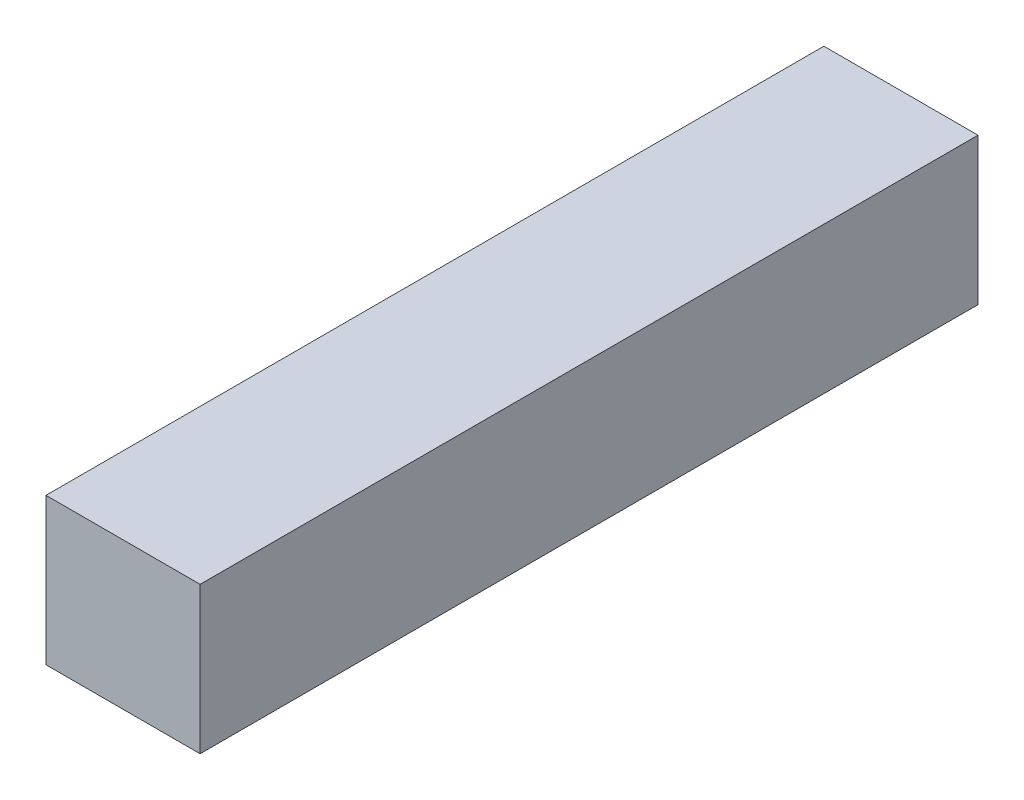
ISO-10303-21;
HEADER;
FILE_DESCRIPTION(('STEP AP214'),'2;1');
FILE_NAME('part.step','',(''),(''),'','','');
FILE_SCHEMA(('AUTOMOTIVE_DESIGN { 1 0 10303 214 1 1 1 1 }'));
ENDSEC;
DATA;
#1=APPLICATION_CONTEXT('core data for automotive mechanical design processes');
#2=APPLICATION_PROTOCOL_DEFINITION('international standard','automotive_design',2000,#1);
#3=PRODUCT_CONTEXT('',#1,'mechanical');
#4=PRODUCT('Part','Part','',(#3));
#5=PRODUCT_RELATED_PRODUCT_CATEGORY('part','',(#4));
#6=PRODUCT_DEFINITION_FORMATION('','',#4);
#7=PRODUCT_DEFINITION_CONTEXT('part definition',#1,'design');
#8=PRODUCT_DEFINITION('design','',#6,#7);
#9=PRODUCT_DEFINITION_SHAPE('','',#8);
#10=(LENGTH_UNIT() NAMED_UNIT(*) SI_UNIT(.MILLI.,.METRE.));
#11=(NAMED_UNIT(*) PLANE_ANGLE_UNIT() SI_UNIT($,.RADIAN.));
#12=(NAMED_UNIT(*) SI_UNIT($,.STERADIAN.) SOLID_ANGLE_UNIT());
#13=UNCERTAINTY_MEASURE_WITH_UNIT(LENGTH_MEASURE(1.E-05),#10,'distance_accuracy_value','');
#14=(GEOMETRIC_REPRESENTATION_CONTEXT(3) GLOBAL_UNCERTAINTY_ASSIGNED_CONTEXT((#13)) GLOBAL_UNIT_ASSIGNED_CONTEXT((#10,
#11,#12)) REPRESENTATION_CONTEXT('',''));
#15=CARTESIAN_POINT('',(0.,0.,0.));
#16=DIRECTION('',(0.,0.,1.));
#17=DIRECTION('',(1.,0.,0.));
#18=AXIS2_PLACEMENT_3D('',#15,#16,#17);
#19=CARTESIAN_POINT('',(0.,0.,318.));
#20=DIRECTION('',(-1.,0.,0.));
#21=DIRECTION('',(0.,-1.,0.));
#22=AXIS2_PLACEMENT_3D('',#19,#20,#21);
#23=PLANE('',#22);
#24=DIRECTION('',(0.,1.,0.));
#25=VECTOR('',#24,1.);
#26=CARTESIAN_POINT('',(0.,0.,0.));
#27=LINE('',#26,#25);
#28=CARTESIAN_POINT('',(0.,0.,0.));
#29=VERTEX_POINT('',#28);
#30=CARTESIAN_POINT('',(0.,60.,0.));
#31=VERTEX_POINT('',#30);
#32=EDGE_CURVE('E98',#29,#31,#27,.T.);
#33=ORIENTED_EDGE('',*,*,#32,.T.);
#34=DIRECTION('',(0.,0.,-1.));
#35=VECTOR('',#34,1.);
#36=CARTESIAN_POINT('',(0.,60.,318.));
#37=LINE('',#36,#35);
#38=CARTESIAN_POINT('',(0.,60.,318.));
#39=VERTEX_POINT('',#38);
#40=EDGE_CURVE('E11',#39,#31,#37,.T.);
#41=ORIENTED_EDGE('',*,*,#40,.F.);
#42=DIRECTION('',(0.,1.,0.));
#43=VECTOR('',#42,1.);
#44=CARTESIAN_POINT('',(0.,0.,318.));
#45=LINE('',#44,#43);
#46=CARTESIAN_POINT('',(0.,0.,318.));
#47=VERTEX_POINT('',#46);
#48=EDGE_CURVE('E86',#47,#39,#45,.T.);
#49=ORIENTED_EDGE('',*,*,#48,.F.);
#50=DIRECTION('',(0.,0.,-1.));
#51=VECTOR('',#50,1.);
#52=CARTESIAN_POINT('',(0.,0.,318.));
#53=LINE('',#52,#51);
#54=EDGE_CURVE('E94',#47,#29,#53,.T.);
#55=ORIENTED_EDGE('',*,*,#54,.T.);
#56=EDGE_LOOP('',(#33,#41,#49,#55));
#57=FACE_BOUND('',#56,.T.);
#58=ADVANCED_FACE('F35',(#57),#23,.F.);
#59=CARTESIAN_POINT('',(0.,60.,318.));
#60=DIRECTION('',(0.,-1.,0.));
#61=DIRECTION('',(1.,0.,0.));
#62=AXIS2_PLACEMENT_3D('',#59,#60,#61);
#63=PLANE('',#62);
#64=DIRECTION('',(-1.,0.,0.));
#65=VECTOR('',#64,1.);
#66=CARTESIAN_POINT('',(0.,60.,0.));
#67=LINE('',#66,#65);
#68=CARTESIAN_POINT('',(-63.,60.,0.));
#69=VERTEX_POINT('',#68);
#70=EDGE_CURVE('E90',#31,#69,#67,.T.);
#71=ORIENTED_EDGE('',*,*,#70,.T.);
#72=DIRECTION('',(0.,0.,-1.));
#73=VECTOR('',#72,1.);
#74=CARTESIAN_POINT('',(-63.,60.,318.));
#75=LINE('',#74,#73);
#76=CARTESIAN_POINT('',(-63.,60.,318.));
#77=VERTEX_POINT('',#76);
#78=EDGE_CURVE('E43',#77,#69,#75,.T.);
#79=ORIENTED_EDGE('',*,*,#78,.F.);
#80=DIRECTION('',(-1.,0.,0.));
#81=VECTOR('',#80,1.);
#82=CARTESIAN_POINT('',(0.,60.,318.));
#83=LINE('',#82,#81);
#84=EDGE_CURVE('E81',#39,#77,#83,.T.);
#85=ORIENTED_EDGE('',*,*,#84,.F.);
#86=ORIENTED_EDGE('',*,*,#40,.T.);
#87=EDGE_LOOP('',(#71,#79,#85,#86));
#88=FACE_BOUND('',#87,.T.);
#89=ADVANCED_FACE('F89',(#88),#63,.F.);
#90=CARTESIAN_POINT('',(-63.,0.,318.));
#91=DIRECTION('',(1.,0.,0.));
#92=DIRECTION('',(0.,0.,-1.));
#93=AXIS2_PLACEMENT_3D('',#90,#91,#92);
#94=PLANE('',#93);
#95=DIRECTION('',(0.,-1.,0.));
#96=VECTOR('',#95,1.);
#97=CARTESIAN_POINT('',(-63.,0.,0.));
#98=LINE('',#97,#96);
#99=CARTESIAN_POINT('',(-63.,0.,0.));
#100=VERTEX_POINT('',#99);
#101=EDGE_CURVE('E68',#69,#100,#98,.T.);
#102=ORIENTED_EDGE('',*,*,#101,.T.);
#103=DIRECTION('',(0.,0.,-1.));
#104=VECTOR('',#103,1.);
#105=CARTESIAN_POINT('',(-63.,0.,318.));
#106=LINE('',#105,#104);
#107=CARTESIAN_POINT('',(-63.,0.,318.));
#108=VERTEX_POINT('',#107);
#109=EDGE_CURVE('E91',#108,#100,#106,.T.);
#110=ORIENTED_EDGE('',*,*,#109,.F.);
#111=DIRECTION('',(0.,-1.,0.));
#112=VECTOR('',#111,1.);
#113=CARTESIAN_POINT('',(-63.,0.,318.));
#114=LINE('',#113,#112);
#115=EDGE_CURVE('E84',#77,#108,#114,.T.);
#116=ORIENTED_EDGE('',*,*,#115,.F.);
#117=ORIENTED_EDGE('',*,*,#78,.T.);
#118=EDGE_LOOP('',(#102,#110,#116,#117));
#119=FACE_BOUND('',#118,.T.);
#120=ADVANCED_FACE('F92',(#119),#94,.F.);
#121=CARTESIAN_POINT('',(0.,0.,318.));
#122=DIRECTION('',(0.,1.,0.));
#123=DIRECTION('',(-1.,0.,0.));
#124=AXIS2_PLACEMENT_3D('',#121,#122,#123);
#125=PLANE('',#124);
#126=DIRECTION('',(1.,0.,0.));
#127=VECTOR('',#126,1.);
#128=CARTESIAN_POINT('',(0.,0.,0.));
#129=LINE('',#128,#127);
#130=EDGE_CURVE('E74',#100,#29,#129,.T.);
#131=ORIENTED_EDGE('',*,*,#130,.T.);
#132=ORIENTED_EDGE('',*,*,#54,.F.);
#133=DIRECTION('',(1.,0.,0.));
#134=VECTOR('',#133,1.);
#135=CARTESIAN_POINT('',(0.,0.,318.));
#136=LINE('',#135,#134);
#137=EDGE_CURVE('E51',#108,#47,#136,.T.);
#138=ORIENTED_EDGE('',*,*,#137,.F.);
#139=ORIENTED_EDGE('',*,*,#109,.T.);
#140=EDGE_LOOP('',(#131,#132,#138,#139));
#141=FACE_BOUND('',#140,.T.);
#142=ADVANCED_FACE('F105',(#141),#125,.F.);
#143=CARTESIAN_POINT('',(0.,0.,318.));
#144=DIRECTION('',(0.,0.,1.));
#145=DIRECTION('',(1.,0.,0.));
#146=AXIS2_PLACEMENT_3D('',#143,#144,#145);
#147=PLANE('',#146);
#148=ORIENTED_EDGE('',*,*,#48,.T.);
#149=ORIENTED_EDGE('',*,*,#84,.T.);
#150=ORIENTED_EDGE('',*,*,#115,.T.);
#151=ORIENTED_EDGE('',*,*,#137,.T.);
#152=EDGE_LOOP('',(#148,#149,#150,#151));
#153=FACE_BOUND('',#152,.T.);
#154=ADVANCED_FACE('F82',(#153),#147,.T.);
#155=CARTESIAN_POINT('',(0.,0.,0.));
#156=DIRECTION('',(0.,0.,1.));
#157=DIRECTION('',(1.,0.,0.));
#158=AXIS2_PLACEMENT_3D('',#155,#156,#157);
#159=PLANE('',#158);
#160=ORIENTED_EDGE('',*,*,#32,.F.);
#161=ORIENTED_EDGE('',*,*,#130,.F.);
#162=ORIENTED_EDGE('',*,*,#101,.F.);
#163=ORIENTED_EDGE('',*,*,#70,.F.);
#164=EDGE_LOOP('',(#160,#161,#162,#163));
#165=FACE_BOUND('',#164,.T.);
#166=ADVANCED_FACE('F108',(#165),#159,.F.);
#167=CLOSED_SHELL('',(#58,#89,#120,#142,#154,#166));
#168=MANIFOLD_SOLID_BREP('B2',#167);
#169=ADVANCED_BREP_SHAPE_REPRESENTATION('',(#18,#168),#14);
#170=SHAPE_DEFINITION_REPRESENTATION(#9,#169);
ENDSEC;
END-ISO-10303-21;
